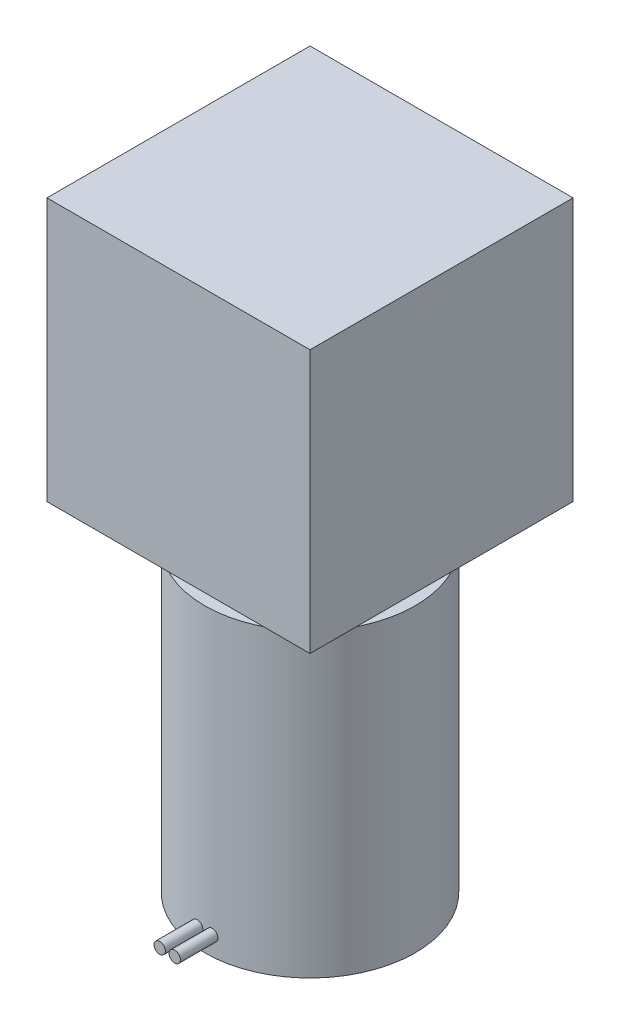
ISO-10303-21;
HEADER;
FILE_DESCRIPTION(('STEP AP214'),'2;1');
FILE_NAME('part.step','',(''),(''),'','','');
FILE_SCHEMA(('AUTOMOTIVE_DESIGN { 1 0 10303 214 1 1 1 1 }'));
ENDSEC;
DATA;
#1=APPLICATION_CONTEXT('core data for automotive mechanical design processes');
#2=APPLICATION_PROTOCOL_DEFINITION('international standard','automotive_design',2000,#1);
#3=PRODUCT_CONTEXT('',#1,'mechanical');
#4=PRODUCT('Part','Part','',(#3));
#5=PRODUCT_RELATED_PRODUCT_CATEGORY('part','',(#4));
#6=PRODUCT_DEFINITION_FORMATION('','',#4);
#7=PRODUCT_DEFINITION_CONTEXT('part definition',#1,'design');
#8=PRODUCT_DEFINITION('design','',#6,#7);
#9=PRODUCT_DEFINITION_SHAPE('','',#8);
#10=(LENGTH_UNIT() NAMED_UNIT(*) SI_UNIT(.MILLI.,.METRE.));
#11=(NAMED_UNIT(*) PLANE_ANGLE_UNIT() SI_UNIT($,.RADIAN.));
#12=(NAMED_UNIT(*) SI_UNIT($,.STERADIAN.) SOLID_ANGLE_UNIT());
#13=UNCERTAINTY_MEASURE_WITH_UNIT(LENGTH_MEASURE(1.E-05),#10,'distance_accuracy_value','');
#14=(GEOMETRIC_REPRESENTATION_CONTEXT(3) GLOBAL_UNCERTAINTY_ASSIGNED_CONTEXT((#13)) GLOBAL_UNIT_ASSIGNED_CONTEXT((#10,
#11,#12)) REPRESENTATION_CONTEXT('',''));
#15=CARTESIAN_POINT('',(0.,0.,0.));
#16=DIRECTION('',(0.,0.,1.));
#17=DIRECTION('',(1.,0.,0.));
#18=AXIS2_PLACEMENT_3D('',#15,#16,#17);
#19=CARTESIAN_POINT('',(2.,5.15388931428029,38.));
#20=DIRECTION('',(0.,0.,-1.));
#21=DIRECTION('',(-1.,0.,0.));
#22=AXIS2_PLACEMENT_3D('',#19,#20,#21);
#23=CYLINDRICAL_SURFACE('',#22,1.5);
#24=CARTESIAN_POINT('',(2.,5.15388931428029,38.));
#25=DIRECTION('',(0.,0.,1.));
#26=DIRECTION('',(1.,0.,0.));
#27=AXIS2_PLACEMENT_3D('',#24,#25,#26);
#28=CIRCLE('',#27,1.5);
#29=CARTESIAN_POINT('',(3.5,5.15388931428029,38.));
#30=VERTEX_POINT('',#29);
#31=EDGE_CURVE('E11',#30,#30,#28,.T.);
#32=ORIENTED_EDGE('',*,*,#31,.F.);
#33=EDGE_LOOP('',(#32));
#34=FACE_BOUND('',#33,.T.);
#35=CARTESIAN_POINT('',(2.,5.15388931428029,28.));
#36=DIRECTION('',(0.,0.,1.));
#37=DIRECTION('',(1.,0.,0.));
#38=AXIS2_PLACEMENT_3D('',#35,#36,#37);
#39=CIRCLE('',#38,1.5);
#40=CARTESIAN_POINT('',(3.5,5.15388931428029,28.));
#41=VERTEX_POINT('',#40);
#42=EDGE_CURVE('E63',#41,#41,#39,.T.);
#43=ORIENTED_EDGE('',*,*,#42,.T.);
#44=EDGE_LOOP('',(#43));
#45=FACE_BOUND('',#44,.T.);
#46=ADVANCED_FACE('F60',(#34,#45),#23,.T.);
#47=CARTESIAN_POINT('',(2.,5.15388931428029,38.));
#48=DIRECTION('',(0.,0.,1.));
#49=DIRECTION('',(1.,0.,0.));
#50=AXIS2_PLACEMENT_3D('',#47,#48,#49);
#51=PLANE('',#50);
#52=ORIENTED_EDGE('',*,*,#31,.T.);
#53=EDGE_LOOP('',(#52));
#54=FACE_BOUND('',#53,.T.);
#55=ADVANCED_FACE('F77',(#54),#51,.T.);
#56=CARTESIAN_POINT('',(2.,5.15388931428029,28.));
#57=DIRECTION('',(0.,0.,1.));
#58=DIRECTION('',(1.,0.,0.));
#59=AXIS2_PLACEMENT_3D('',#56,#57,#58);
#60=PLANE('',#59);
#61=ORIENTED_EDGE('',*,*,#42,.F.);
#62=EDGE_LOOP('',(#61));
#63=FACE_BOUND('',#62,.T.);
#64=ADVANCED_FACE('F75',(#63),#60,.F.);
#65=CLOSED_SHELL('',(#46,#55,#64));
#66=MANIFOLD_SOLID_BREP('B2',#65);
#67=CARTESIAN_POINT('',(-2.,5.15388931428029,38.));
#68=DIRECTION('',(0.,0.,-1.));
#69=DIRECTION('',(-1.,0.,0.));
#70=AXIS2_PLACEMENT_3D('',#67,#68,#69);
#71=CYLINDRICAL_SURFACE('',#70,1.5);
#72=CARTESIAN_POINT('',(-2.,5.15388931428029,38.));
#73=DIRECTION('',(0.,0.,1.));
#74=DIRECTION('',(1.,0.,0.));
#75=AXIS2_PLACEMENT_3D('',#72,#73,#74);
#76=CIRCLE('',#75,1.5);
#77=CARTESIAN_POINT('',(-0.5,5.15388931428029,38.));
#78=VERTEX_POINT('',#77);
#79=EDGE_CURVE('E59',#78,#78,#76,.T.);
#80=ORIENTED_EDGE('',*,*,#79,.F.);
#81=EDGE_LOOP('',(#80));
#82=FACE_BOUND('',#81,.T.);
#83=CARTESIAN_POINT('',(-2.,5.15388931428029,28.));
#84=DIRECTION('',(0.,0.,1.));
#85=DIRECTION('',(1.,0.,0.));
#86=AXIS2_PLACEMENT_3D('',#83,#84,#85);
#87=CIRCLE('',#86,1.5);
#88=CARTESIAN_POINT('',(-0.5,5.15388931428029,28.));
#89=VERTEX_POINT('',#88);
#90=EDGE_CURVE('E124',#89,#89,#87,.T.);
#91=ORIENTED_EDGE('',*,*,#90,.T.);
#92=EDGE_LOOP('',(#91));
#93=FACE_BOUND('',#92,.T.);
#94=ADVANCED_FACE('F121',(#82,#93),#71,.T.);
#95=CARTESIAN_POINT('',(-2.,5.15388931428029,38.));
#96=DIRECTION('',(0.,0.,1.));
#97=DIRECTION('',(1.,0.,0.));
#98=AXIS2_PLACEMENT_3D('',#95,#96,#97);
#99=PLANE('',#98);
#100=ORIENTED_EDGE('',*,*,#79,.T.);
#101=EDGE_LOOP('',(#100));
#102=FACE_BOUND('',#101,.T.);
#103=ADVANCED_FACE('F138',(#102),#99,.T.);
#104=CARTESIAN_POINT('',(-2.,5.15388931428029,28.));
#105=DIRECTION('',(0.,0.,1.));
#106=DIRECTION('',(1.,0.,0.));
#107=AXIS2_PLACEMENT_3D('',#104,#105,#106);
#108=PLANE('',#107);
#109=ORIENTED_EDGE('',*,*,#90,.F.);
#110=EDGE_LOOP('',(#109));
#111=FACE_BOUND('',#110,.T.);
#112=ADVANCED_FACE('F136',(#111),#108,.F.);
#113=CLOSED_SHELL('',(#94,#103,#112));
#114=MANIFOLD_SOLID_BREP('B6',#113);
#115=CARTESIAN_POINT('',(0.,80.,0.));
#116=DIRECTION('',(0.,-1.,0.));
#117=DIRECTION('',(0.,0.,-1.));
#118=AXIS2_PLACEMENT_3D('',#115,#116,#117);
#119=CYLINDRICAL_SURFACE('',#118,28.);
#120=CARTESIAN_POINT('',(0.,80.,0.));
#121=DIRECTION('',(0.,1.,0.));
#122=DIRECTION('',(0.,0.,1.));
#123=AXIS2_PLACEMENT_3D('',#120,#121,#122);
#124=CIRCLE('',#123,28.);
#125=CARTESIAN_POINT('',(0.,80.,28.));
#126=VERTEX_POINT('',#125);
#127=EDGE_CURVE('E182',#126,#126,#124,.T.);
#128=ORIENTED_EDGE('',*,*,#127,.F.);
#129=EDGE_LOOP('',(#128));
#130=FACE_BOUND('',#129,.T.);
#131=CARTESIAN_POINT('',(0.,0.,0.));
#132=DIRECTION('',(0.,1.,0.));
#133=DIRECTION('',(0.,0.,1.));
#134=AXIS2_PLACEMENT_3D('',#131,#132,#133);
#135=CIRCLE('',#134,28.);
#136=CARTESIAN_POINT('',(0.,0.,28.));
#137=VERTEX_POINT('',#136);
#138=EDGE_CURVE('E176',#137,#137,#135,.T.);
#139=ORIENTED_EDGE('',*,*,#138,.T.);
#140=EDGE_LOOP('',(#139));
#141=FACE_BOUND('',#140,.T.);
#142=ADVANCED_FACE('F173',(#130,#141),#119,.T.);
#143=CARTESIAN_POINT('',(0.,80.,0.));
#144=DIRECTION('',(0.,1.,0.));
#145=DIRECTION('',(0.,0.,1.));
#146=AXIS2_PLACEMENT_3D('',#143,#144,#145);
#147=PLANE('',#146);
#148=CARTESIAN_POINT('',(0.,80.,0.));
#149=DIRECTION('',(0.,1.,0.));
#150=DIRECTION('',(0.,0.,1.));
#151=AXIS2_PLACEMENT_3D('',#148,#149,#150);
#152=CIRCLE('',#151,22.5);
#153=CARTESIAN_POINT('',(0.,80.,22.5));
#154=VERTEX_POINT('',#153);
#155=EDGE_CURVE('E119',#154,#154,#152,.T.);
#156=ORIENTED_EDGE('',*,*,#155,.F.);
#157=EDGE_LOOP('',(#156));
#158=FACE_BOUND('',#157,.T.);
#159=ORIENTED_EDGE('',*,*,#127,.T.);
#160=EDGE_LOOP('',(#159));
#161=FACE_BOUND('',#160,.T.);
#162=ADVANCED_FACE('F420',(#158,#161),#147,.T.);
#163=CARTESIAN_POINT('',(0.,0.,0.));
#164=DIRECTION('',(0.,1.,0.));
#165=DIRECTION('',(0.,0.,1.));
#166=AXIS2_PLACEMENT_3D('',#163,#164,#165);
#167=PLANE('',#166);
#168=ORIENTED_EDGE('',*,*,#138,.F.);
#169=EDGE_LOOP('',(#168));
#170=FACE_BOUND('',#169,.T.);
#171=ADVANCED_FACE('F417',(#170),#167,.F.);
#172=CARTESIAN_POINT('',(0.,90.,0.));
#173=DIRECTION('',(0.,-1.,0.));
#174=DIRECTION('',(0.,0.,-1.));
#175=AXIS2_PLACEMENT_3D('',#172,#173,#174);
#176=CYLINDRICAL_SURFACE('',#175,22.5);
#177=CARTESIAN_POINT('',(0.,90.,0.));
#178=DIRECTION('',(0.,1.,0.));
#179=DIRECTION('',(0.,0.,1.));
#180=AXIS2_PLACEMENT_3D('',#177,#178,#179);
#181=CIRCLE('',#180,22.5);
#182=CARTESIAN_POINT('',(0.,90.,22.5));
#183=VERTEX_POINT('',#182);
#184=EDGE_CURVE('E402',#183,#183,#181,.T.);
#185=ORIENTED_EDGE('',*,*,#184,.F.);
#186=EDGE_LOOP('',(#185));
#187=FACE_BOUND('',#186,.T.);
#188=ORIENTED_EDGE('',*,*,#155,.T.);
#189=EDGE_LOOP('',(#188));
#190=FACE_BOUND('',#189,.T.);
#191=ADVANCED_FACE('F419',(#187,#190),#176,.T.);
#192=CARTESIAN_POINT('',(35.,160.,-35.));
#193=DIRECTION('',(-1.,0.,0.));
#194=DIRECTION('',(0.,0.,1.));
#195=AXIS2_PLACEMENT_3D('',#192,#193,#194);
#196=PLANE('',#195);
#197=DIRECTION('',(0.,0.,-1.));
#198=VECTOR('',#197,1.);
#199=CARTESIAN_POINT('',(35.,90.,-35.));
#200=LINE('',#199,#198);
#201=CARTESIAN_POINT('',(35.,90.,35.));
#202=VERTEX_POINT('',#201);
#203=CARTESIAN_POINT('',(35.,90.,-35.));
#204=VERTEX_POINT('',#203);
#205=EDGE_CURVE('E365',#202,#204,#200,.T.);
#206=ORIENTED_EDGE('',*,*,#205,.T.);
#207=DIRECTION('',(0.,-1.,0.));
#208=VECTOR('',#207,1.);
#209=CARTESIAN_POINT('',(35.,160.,-35.));
#210=LINE('',#209,#208);
#211=CARTESIAN_POINT('',(35.,160.,-35.));
#212=VERTEX_POINT('',#211);
#213=EDGE_CURVE('E399',#212,#204,#210,.T.);
#214=ORIENTED_EDGE('',*,*,#213,.F.);
#215=DIRECTION('',(0.,0.,-1.));
#216=VECTOR('',#215,1.);
#217=CARTESIAN_POINT('',(35.,160.,-35.));
#218=LINE('',#217,#216);
#219=CARTESIAN_POINT('',(35.,160.,35.));
#220=VERTEX_POINT('',#219);
#221=EDGE_CURVE('E369',#220,#212,#218,.T.);
#222=ORIENTED_EDGE('',*,*,#221,.F.);
#223=DIRECTION('',(0.,-1.,0.));
#224=VECTOR('',#223,1.);
#225=CARTESIAN_POINT('',(35.,160.,35.));
#226=LINE('',#225,#224);
#227=EDGE_CURVE('E379',#220,#202,#226,.T.);
#228=ORIENTED_EDGE('',*,*,#227,.T.);
#229=EDGE_LOOP('',(#206,#214,#222,#228));
#230=FACE_BOUND('',#229,.T.);
#231=ADVANCED_FACE('F424',(#230),#196,.F.);
#232=CARTESIAN_POINT('',(-35.,160.,-35.));
#233=DIRECTION('',(0.,0.,1.));
#234=DIRECTION('',(1.,0.,0.));
#235=AXIS2_PLACEMENT_3D('',#232,#233,#234);
#236=PLANE('',#235);
#237=DIRECTION('',(-1.,0.,0.));
#238=VECTOR('',#237,1.);
#239=CARTESIAN_POINT('',(-35.,90.,-35.));
#240=LINE('',#239,#238);
#241=CARTESIAN_POINT('',(-35.,90.,-35.));
#242=VERTEX_POINT('',#241);
#243=EDGE_CURVE('E383',#204,#242,#240,.T.);
#244=ORIENTED_EDGE('',*,*,#243,.T.);
#245=DIRECTION('',(0.,-1.,0.));
#246=VECTOR('',#245,1.);
#247=CARTESIAN_POINT('',(-35.,160.,-35.));
#248=LINE('',#247,#246);
#249=CARTESIAN_POINT('',(-35.,160.,-35.));
#250=VERTEX_POINT('',#249);
#251=EDGE_CURVE('E395',#250,#242,#248,.T.);
#252=ORIENTED_EDGE('',*,*,#251,.F.);
#253=DIRECTION('',(-1.,0.,0.));
#254=VECTOR('',#253,1.);
#255=CARTESIAN_POINT('',(-35.,160.,-35.));
#256=LINE('',#255,#254);
#257=EDGE_CURVE('E228',#212,#250,#256,.T.);
#258=ORIENTED_EDGE('',*,*,#257,.F.);
#259=ORIENTED_EDGE('',*,*,#213,.T.);
#260=EDGE_LOOP('',(#244,#252,#258,#259));
#261=FACE_BOUND('',#260,.T.);
#262=ADVANCED_FACE('F451',(#261),#236,.F.);
#263=CARTESIAN_POINT('',(-35.,160.,-35.));
#264=DIRECTION('',(1.,0.,0.));
#265=DIRECTION('',(0.,0.,-1.));
#266=AXIS2_PLACEMENT_3D('',#263,#264,#265);
#267=PLANE('',#266);
#268=CARTESIAN_POINT('',(-35.,125.,0.));
#269=DIRECTION('',(-1.,0.,0.));
#270=DIRECTION('',(0.,0.,1.));
#271=AXIS2_PLACEMENT_3D('',#268,#269,#270);
#272=CIRCLE('',#271,18.4154380014951);
#273=CARTESIAN_POINT('',(-35.,125.,18.4154380014951));
#274=VERTEX_POINT('',#273);
#275=EDGE_CURVE('E728',#274,#274,#272,.T.);
#276=ORIENTED_EDGE('',*,*,#275,.F.);
#277=EDGE_LOOP('',(#276));
#278=FACE_BOUND('',#277,.T.);
#279=CARTESIAN_POINT('',(-35.,152.,0.));
#280=DIRECTION('',(-1.,0.,0.));
#281=DIRECTION('',(0.,0.,1.));
#282=AXIS2_PLACEMENT_3D('',#279,#280,#281);
#283=CIRCLE('',#282,2.5);
#284=CARTESIAN_POINT('',(-35.,152.,2.50000000000001));
#285=VERTEX_POINT('',#284);
#286=EDGE_CURVE('E336',#285,#285,#283,.T.);
#287=ORIENTED_EDGE('',*,*,#286,.F.);
#288=EDGE_LOOP('',(#287));
#289=FACE_BOUND('',#288,.T.);
#290=CARTESIAN_POINT('',(-35.,144.091883092037,19.091883092037));
#291=DIRECTION('',(-1.,0.,0.));
#292=DIRECTION('',(0.,0.,1.));
#293=AXIS2_PLACEMENT_3D('',#290,#291,#292);
#294=CIRCLE('',#293,2.50000000000001);
#295=CARTESIAN_POINT('',(-35.,144.091883092037,21.591883092037));
#296=VERTEX_POINT('',#295);
#297=EDGE_CURVE('E344',#296,#296,#294,.T.);
#298=ORIENTED_EDGE('',*,*,#297,.F.);
#299=EDGE_LOOP('',(#298));
#300=FACE_BOUND('',#299,.T.);
#301=CARTESIAN_POINT('',(-35.,125.000000000001,27.0000000000007));
#302=DIRECTION('',(-1.,0.,0.));
#303=DIRECTION('',(0.,0.,1.));
#304=AXIS2_PLACEMENT_3D('',#301,#302,#303);
#305=CIRCLE('',#304,2.50000000000001);
#306=CARTESIAN_POINT('',(-35.,125.000000000001,29.5000000000008));
#307=VERTEX_POINT('',#306);
#308=EDGE_CURVE('E352',#307,#307,#305,.T.);
#309=ORIENTED_EDGE('',*,*,#308,.F.);
#310=EDGE_LOOP('',(#309));
#311=FACE_BOUND('',#310,.T.);
#312=CARTESIAN_POINT('',(-35.,105.908116907964,19.091883092038));
#313=DIRECTION('',(-1.,0.,0.));
#314=DIRECTION('',(0.,0.,1.));
#315=AXIS2_PLACEMENT_3D('',#312,#313,#314);
#316=CIRCLE('',#315,2.49999999999999);
#317=CARTESIAN_POINT('',(-35.,105.908116907964,21.591883092038));
#318=VERTEX_POINT('',#317);
#319=EDGE_CURVE('E304',#318,#318,#316,.T.);
#320=ORIENTED_EDGE('',*,*,#319,.F.);
#321=EDGE_LOOP('',(#320));
#322=FACE_BOUND('',#321,.T.);
#323=CARTESIAN_POINT('',(-35.,98.,1.33647557846545E-12));
#324=DIRECTION('',(-1.,0.,0.));
#325=DIRECTION('',(0.,0.,1.));
#326=AXIS2_PLACEMENT_3D('',#323,#324,#325);
#327=CIRCLE('',#326,2.5);
#328=CARTESIAN_POINT('',(-35.,98.,2.50000000000134));
#329=VERTEX_POINT('',#328);
#330=EDGE_CURVE('E305',#329,#329,#327,.T.);
#331=ORIENTED_EDGE('',*,*,#330,.F.);
#332=EDGE_LOOP('',(#331));
#333=FACE_BOUND('',#332,.T.);
#334=CARTESIAN_POINT('',(-35.,105.908116907963,-19.0918830920357));
#335=DIRECTION('',(-1.,0.,0.));
#336=DIRECTION('',(0.,0.,1.));
#337=AXIS2_PLACEMENT_3D('',#334,#335,#336);
#338=CIRCLE('',#337,2.49999999999999);
#339=CARTESIAN_POINT('',(-35.,105.908116907963,-16.5918830920357));
#340=VERTEX_POINT('',#339);
#341=EDGE_CURVE('E313',#340,#340,#338,.T.);
#342=ORIENTED_EDGE('',*,*,#341,.F.);
#343=EDGE_LOOP('',(#342));
#344=FACE_BOUND('',#343,.T.);
#345=CARTESIAN_POINT('',(-35.,125.,-26.9999999999992));
#346=DIRECTION('',(-1.,0.,0.));
#347=DIRECTION('',(0.,0.,1.));
#348=AXIS2_PLACEMENT_3D('',#345,#346,#347);
#349=CIRCLE('',#348,2.5);
#350=CARTESIAN_POINT('',(-35.,125.,-24.4999999999992));
#351=VERTEX_POINT('',#350);
#352=EDGE_CURVE('E321',#351,#351,#349,.T.);
#353=ORIENTED_EDGE('',*,*,#352,.F.);
#354=EDGE_LOOP('',(#353));
#355=FACE_BOUND('',#354,.T.);
#356=CARTESIAN_POINT('',(-35.,144.091883092036,-19.0918830920363));
#357=DIRECTION('',(-1.,0.,0.));
#358=DIRECTION('',(0.,0.,1.));
#359=AXIS2_PLACEMENT_3D('',#356,#357,#358);
#360=CIRCLE('',#359,2.49999999999999);
#361=CARTESIAN_POINT('',(-35.,144.091883092036,-16.5918830920363));
#362=VERTEX_POINT('',#361);
#363=EDGE_CURVE('E299',#362,#362,#360,.T.);
#364=ORIENTED_EDGE('',*,*,#363,.F.);
#365=EDGE_LOOP('',(#364));
#366=FACE_BOUND('',#365,.T.);
#367=DIRECTION('',(0.,0.,1.));
#368=VECTOR('',#367,1.);
#369=CARTESIAN_POINT('',(-35.,90.,-35.));
#370=LINE('',#369,#368);
#371=CARTESIAN_POINT('',(-35.,90.,35.));
#372=VERTEX_POINT('',#371);
#373=EDGE_CURVE('E386',#242,#372,#370,.T.);
#374=ORIENTED_EDGE('',*,*,#373,.T.);
#375=DIRECTION('',(0.,-1.,0.));
#376=VECTOR('',#375,1.);
#377=CARTESIAN_POINT('',(-35.,160.,35.));
#378=LINE('',#377,#376);
#379=CARTESIAN_POINT('',(-35.,160.,35.));
#380=VERTEX_POINT('',#379);
#381=EDGE_CURVE('E392',#380,#372,#378,.T.);
#382=ORIENTED_EDGE('',*,*,#381,.F.);
#383=DIRECTION('',(0.,0.,1.));
#384=VECTOR('',#383,1.);
#385=CARTESIAN_POINT('',(-35.,160.,-35.));
#386=LINE('',#385,#384);
#387=EDGE_CURVE('E374',#250,#380,#386,.T.);
#388=ORIENTED_EDGE('',*,*,#387,.F.);
#389=ORIENTED_EDGE('',*,*,#251,.T.);
#390=EDGE_LOOP('',(#374,#382,#388,#389));
#391=FACE_BOUND('',#390,.T.);
#392=ADVANCED_FACE('F460',(#278,#289,#300,#311,#322,#333,#344,#355,#366,#391),#267,.F.);
#393=CARTESIAN_POINT('',(-35.,160.,35.));
#394=DIRECTION('',(0.,0.,-1.));
#395=DIRECTION('',(-1.,0.,0.));
#396=AXIS2_PLACEMENT_3D('',#393,#394,#395);
#397=PLANE('',#396);
#398=DIRECTION('',(1.,0.,0.));
#399=VECTOR('',#398,1.);
#400=CARTESIAN_POINT('',(-35.,90.,35.));
#401=LINE('',#400,#399);
#402=EDGE_CURVE('E220',#372,#202,#401,.T.);
#403=ORIENTED_EDGE('',*,*,#402,.T.);
#404=ORIENTED_EDGE('',*,*,#227,.F.);
#405=DIRECTION('',(1.,0.,0.));
#406=VECTOR('',#405,1.);
#407=CARTESIAN_POINT('',(-35.,160.,35.));
#408=LINE('',#407,#406);
#409=EDGE_CURVE('E199',#380,#220,#408,.T.);
#410=ORIENTED_EDGE('',*,*,#409,.F.);
#411=ORIENTED_EDGE('',*,*,#381,.T.);
#412=EDGE_LOOP('',(#403,#404,#410,#411));
#413=FACE_BOUND('',#412,.T.);
#414=ADVANCED_FACE('F466',(#413),#397,.F.);
#415=CARTESIAN_POINT('',(0.,160.,0.));
#416=DIRECTION('',(0.,1.,0.));
#417=DIRECTION('',(0.,0.,1.));
#418=AXIS2_PLACEMENT_3D('',#415,#416,#417);
#419=PLANE('',#418);
#420=ORIENTED_EDGE('',*,*,#221,.T.);
#421=ORIENTED_EDGE('',*,*,#257,.T.);
#422=ORIENTED_EDGE('',*,*,#387,.T.);
#423=ORIENTED_EDGE('',*,*,#409,.T.);
#424=EDGE_LOOP('',(#420,#421,#422,#423));
#425=FACE_BOUND('',#424,.T.);
#426=ADVANCED_FACE('F471',(#425),#419,.T.);
#427=CARTESIAN_POINT('',(0.,90.,0.));
#428=DIRECTION('',(0.,1.,0.));
#429=DIRECTION('',(0.,0.,1.));
#430=AXIS2_PLACEMENT_3D('',#427,#428,#429);
#431=PLANE('',#430);
#432=ORIENTED_EDGE('',*,*,#184,.T.);
#433=EDGE_LOOP('',(#432));
#434=FACE_BOUND('',#433,.T.);
#435=ORIENTED_EDGE('',*,*,#205,.F.);
#436=ORIENTED_EDGE('',*,*,#402,.F.);
#437=ORIENTED_EDGE('',*,*,#373,.F.);
#438=ORIENTED_EDGE('',*,*,#243,.F.);
#439=EDGE_LOOP('',(#435,#436,#437,#438));
#440=FACE_BOUND('',#439,.T.);
#441=ADVANCED_FACE('F479',(#434,#440),#431,.F.);
#442=CARTESIAN_POINT('',(-15.,144.091883092036,-19.0918830920363));
#443=DIRECTION('',(-1.,0.,0.));
#444=DIRECTION('',(0.,0.,1.));
#445=AXIS2_PLACEMENT_3D('',#442,#443,#444);
#446=CYLINDRICAL_SURFACE('',#445,2.49999999999999);
#447=CARTESIAN_POINT('',(-15.,144.091883092036,-19.0918830920363));
#448=DIRECTION('',(-1.,0.,0.));
#449=DIRECTION('',(0.,0.,1.));
#450=AXIS2_PLACEMENT_3D('',#447,#448,#449);
#451=CIRCLE('',#450,2.49999999999999);
#452=CARTESIAN_POINT('',(-15.,144.091883092036,-16.5918830920363));
#453=VERTEX_POINT('',#452);
#454=EDGE_CURVE('E325',#453,#453,#451,.T.);
#455=ORIENTED_EDGE('',*,*,#454,.F.);
#456=EDGE_LOOP('',(#455));
#457=FACE_BOUND('',#456,.T.);
#458=ORIENTED_EDGE('',*,*,#363,.T.);
#459=EDGE_LOOP('',(#458));
#460=FACE_BOUND('',#459,.T.);
#461=ADVANCED_FACE('F487',(#457,#460),#446,.F.);
#462=CARTESIAN_POINT('',(-15.,144.091883092036,-19.0918830920363));
#463=DIRECTION('',(-1.,0.,0.));
#464=DIRECTION('',(0.,0.,1.));
#465=AXIS2_PLACEMENT_3D('',#462,#463,#464);
#466=PLANE('',#465);
#467=ORIENTED_EDGE('',*,*,#454,.T.);
#468=EDGE_LOOP('',(#467));
#469=FACE_BOUND('',#468,.T.);
#470=ADVANCED_FACE('F497',(#469),#466,.T.);
#471=CARTESIAN_POINT('',(-15.,125.,-26.9999999999992));
#472=DIRECTION('',(-1.,0.,0.));
#473=DIRECTION('',(0.,0.,1.));
#474=AXIS2_PLACEMENT_3D('',#471,#472,#473);
#475=CYLINDRICAL_SURFACE('',#474,2.5);
#476=CARTESIAN_POINT('',(-15.,125.,-26.9999999999992));
#477=DIRECTION('',(-1.,0.,0.));
#478=DIRECTION('',(0.,0.,1.));
#479=AXIS2_PLACEMENT_3D('',#476,#477,#478);
#480=CIRCLE('',#479,2.5);
#481=CARTESIAN_POINT('',(-15.,125.,-24.4999999999992));
#482=VERTEX_POINT('',#481);
#483=EDGE_CURVE('E317',#482,#482,#480,.T.);
#484=ORIENTED_EDGE('',*,*,#483,.F.);
#485=EDGE_LOOP('',(#484));
#486=FACE_BOUND('',#485,.T.);
#487=ORIENTED_EDGE('',*,*,#352,.T.);
#488=EDGE_LOOP('',(#487));
#489=FACE_BOUND('',#488,.T.);
#490=ADVANCED_FACE('F507',(#486,#489),#475,.F.);
#491=CARTESIAN_POINT('',(-15.,125.,-26.9999999999992));
#492=DIRECTION('',(-1.,0.,0.));
#493=DIRECTION('',(0.,0.,1.));
#494=AXIS2_PLACEMENT_3D('',#491,#492,#493);
#495=PLANE('',#494);
#496=ORIENTED_EDGE('',*,*,#483,.T.);
#497=EDGE_LOOP('',(#496));
#498=FACE_BOUND('',#497,.T.);
#499=ADVANCED_FACE('F516',(#498),#495,.T.);
#500=CARTESIAN_POINT('',(-15.,105.908116907963,-19.0918830920357));
#501=DIRECTION('',(-1.,0.,0.));
#502=DIRECTION('',(0.,0.,1.));
#503=AXIS2_PLACEMENT_3D('',#500,#501,#502);
#504=CYLINDRICAL_SURFACE('',#503,2.49999999999999);
#505=CARTESIAN_POINT('',(-15.,105.908116907963,-19.0918830920357));
#506=DIRECTION('',(-1.,0.,0.));
#507=DIRECTION('',(0.,0.,1.));
#508=AXIS2_PLACEMENT_3D('',#505,#506,#507);
#509=CIRCLE('',#508,2.49999999999999);
#510=CARTESIAN_POINT('',(-15.,105.908116907963,-16.5918830920357));
#511=VERTEX_POINT('',#510);
#512=EDGE_CURVE('E309',#511,#511,#509,.T.);
#513=ORIENTED_EDGE('',*,*,#512,.F.);
#514=EDGE_LOOP('',(#513));
#515=FACE_BOUND('',#514,.T.);
#516=ORIENTED_EDGE('',*,*,#341,.T.);
#517=EDGE_LOOP('',(#516));
#518=FACE_BOUND('',#517,.T.);
#519=ADVANCED_FACE('F525',(#515,#518),#504,.F.);
#520=CARTESIAN_POINT('',(-15.,105.908116907963,-19.0918830920357));
#521=DIRECTION('',(-1.,0.,0.));
#522=DIRECTION('',(0.,0.,1.));
#523=AXIS2_PLACEMENT_3D('',#520,#521,#522);
#524=PLANE('',#523);
#525=ORIENTED_EDGE('',*,*,#512,.T.);
#526=EDGE_LOOP('',(#525));
#527=FACE_BOUND('',#526,.T.);
#528=ADVANCED_FACE('F534',(#527),#524,.T.);
#529=CARTESIAN_POINT('',(-15.,98.,1.33449303735005E-12));
#530=DIRECTION('',(-1.,0.,0.));
#531=DIRECTION('',(0.,0.,1.));
#532=AXIS2_PLACEMENT_3D('',#529,#530,#531);
#533=CYLINDRICAL_SURFACE('',#532,2.5);
#534=CARTESIAN_POINT('',(-15.,98.,1.33449303735005E-12));
#535=DIRECTION('',(-1.,0.,0.));
#536=DIRECTION('',(0.,0.,1.));
#537=AXIS2_PLACEMENT_3D('',#534,#535,#536);
#538=CIRCLE('',#537,2.5);
#539=CARTESIAN_POINT('',(-15.,98.,2.50000000000133));
#540=VERTEX_POINT('',#539);
#541=EDGE_CURVE('E300',#540,#540,#538,.T.);
#542=ORIENTED_EDGE('',*,*,#541,.F.);
#543=EDGE_LOOP('',(#542));
#544=FACE_BOUND('',#543,.T.);
#545=ORIENTED_EDGE('',*,*,#330,.T.);
#546=EDGE_LOOP('',(#545));
#547=FACE_BOUND('',#546,.T.);
#548=ADVANCED_FACE('F543',(#544,#547),#533,.F.);
#549=CARTESIAN_POINT('',(-15.,98.,1.33449303735005E-12));
#550=DIRECTION('',(-1.,0.,0.));
#551=DIRECTION('',(0.,0.,1.));
#552=AXIS2_PLACEMENT_3D('',#549,#550,#551);
#553=PLANE('',#552);
#554=ORIENTED_EDGE('',*,*,#541,.T.);
#555=EDGE_LOOP('',(#554));
#556=FACE_BOUND('',#555,.T.);
#557=ADVANCED_FACE('F552',(#556),#553,.T.);
#558=CARTESIAN_POINT('',(-15.,105.908116907964,19.091883092038));
#559=DIRECTION('',(-1.,0.,0.));
#560=DIRECTION('',(0.,0.,1.));
#561=AXIS2_PLACEMENT_3D('',#558,#559,#560);
#562=CYLINDRICAL_SURFACE('',#561,2.49999999999999);
#563=CARTESIAN_POINT('',(-15.,105.908116907964,19.091883092038));
#564=DIRECTION('',(-1.,0.,0.));
#565=DIRECTION('',(0.,0.,1.));
#566=AXIS2_PLACEMENT_3D('',#563,#564,#565);
#567=CIRCLE('',#566,2.49999999999999);
#568=CARTESIAN_POINT('',(-15.,105.908116907964,21.591883092038));
#569=VERTEX_POINT('',#568);
#570=EDGE_CURVE('E356',#569,#569,#567,.T.);
#571=ORIENTED_EDGE('',*,*,#570,.F.);
#572=EDGE_LOOP('',(#571));
#573=FACE_BOUND('',#572,.T.);
#574=ORIENTED_EDGE('',*,*,#319,.T.);
#575=EDGE_LOOP('',(#574));
#576=FACE_BOUND('',#575,.T.);
#577=ADVANCED_FACE('F561',(#573,#576),#562,.F.);
#578=CARTESIAN_POINT('',(-15.,105.908116907964,19.091883092038));
#579=DIRECTION('',(-1.,0.,0.));
#580=DIRECTION('',(0.,0.,1.));
#581=AXIS2_PLACEMENT_3D('',#578,#579,#580);
#582=PLANE('',#581);
#583=ORIENTED_EDGE('',*,*,#570,.T.);
#584=EDGE_LOOP('',(#583));
#585=FACE_BOUND('',#584,.T.);
#586=ADVANCED_FACE('F570',(#585),#582,.T.);
#587=CARTESIAN_POINT('',(-15.,125.000000000001,27.0000000000007));
#588=DIRECTION('',(-1.,0.,0.));
#589=DIRECTION('',(0.,0.,1.));
#590=AXIS2_PLACEMENT_3D('',#587,#588,#589);
#591=CYLINDRICAL_SURFACE('',#590,2.50000000000001);
#592=CARTESIAN_POINT('',(-15.,125.000000000001,27.0000000000007));
#593=DIRECTION('',(-1.,0.,0.));
#594=DIRECTION('',(0.,0.,1.));
#595=AXIS2_PLACEMENT_3D('',#592,#593,#594);
#596=CIRCLE('',#595,2.50000000000001);
#597=CARTESIAN_POINT('',(-15.,125.000000000001,29.5000000000008));
#598=VERTEX_POINT('',#597);
#599=EDGE_CURVE('E348',#598,#598,#596,.T.);
#600=ORIENTED_EDGE('',*,*,#599,.F.);
#601=EDGE_LOOP('',(#600));
#602=FACE_BOUND('',#601,.T.);
#603=ORIENTED_EDGE('',*,*,#308,.T.);
#604=EDGE_LOOP('',(#603));
#605=FACE_BOUND('',#604,.T.);
#606=ADVANCED_FACE('F579',(#602,#605),#591,.F.);
#607=CARTESIAN_POINT('',(-15.,125.000000000001,27.0000000000007));
#608=DIRECTION('',(-1.,0.,0.));
#609=DIRECTION('',(0.,0.,1.));
#610=AXIS2_PLACEMENT_3D('',#607,#608,#609);
#611=PLANE('',#610);
#612=ORIENTED_EDGE('',*,*,#599,.T.);
#613=EDGE_LOOP('',(#612));
#614=FACE_BOUND('',#613,.T.);
#615=ADVANCED_FACE('F588',(#614),#611,.T.);
#616=CARTESIAN_POINT('',(-15.,144.091883092037,19.091883092037));
#617=DIRECTION('',(-1.,0.,0.));
#618=DIRECTION('',(0.,0.,1.));
#619=AXIS2_PLACEMENT_3D('',#616,#617,#618);
#620=CYLINDRICAL_SURFACE('',#619,2.50000000000001);
#621=CARTESIAN_POINT('',(-15.,144.091883092037,19.091883092037));
#622=DIRECTION('',(-1.,0.,0.));
#623=DIRECTION('',(0.,0.,1.));
#624=AXIS2_PLACEMENT_3D('',#621,#622,#623);
#625=CIRCLE('',#624,2.50000000000001);
#626=CARTESIAN_POINT('',(-15.,144.091883092037,21.591883092037));
#627=VERTEX_POINT('',#626);
#628=EDGE_CURVE('E340',#627,#627,#625,.T.);
#629=ORIENTED_EDGE('',*,*,#628,.F.);
#630=EDGE_LOOP('',(#629));
#631=FACE_BOUND('',#630,.T.);
#632=ORIENTED_EDGE('',*,*,#297,.T.);
#633=EDGE_LOOP('',(#632));
#634=FACE_BOUND('',#633,.T.);
#635=ADVANCED_FACE('F597',(#631,#634),#620,.F.);
#636=CARTESIAN_POINT('',(-15.,144.091883092037,19.091883092037));
#637=DIRECTION('',(-1.,0.,0.));
#638=DIRECTION('',(0.,0.,1.));
#639=AXIS2_PLACEMENT_3D('',#636,#637,#638);
#640=PLANE('',#639);
#641=ORIENTED_EDGE('',*,*,#628,.T.);
#642=EDGE_LOOP('',(#641));
#643=FACE_BOUND('',#642,.T.);
#644=ADVANCED_FACE('F606',(#643),#640,.T.);
#645=CARTESIAN_POINT('',(-15.,152.,0.));
#646=DIRECTION('',(-1.,0.,0.));
#647=DIRECTION('',(0.,0.,1.));
#648=AXIS2_PLACEMENT_3D('',#645,#646,#647);
#649=CYLINDRICAL_SURFACE('',#648,2.5);
#650=CARTESIAN_POINT('',(-15.,152.,0.));
#651=DIRECTION('',(-1.,0.,0.));
#652=DIRECTION('',(0.,0.,1.));
#653=AXIS2_PLACEMENT_3D('',#650,#651,#652);
#654=CIRCLE('',#653,2.5);
#655=CARTESIAN_POINT('',(-15.,152.,2.5));
#656=VERTEX_POINT('',#655);
#657=EDGE_CURVE('E331',#656,#656,#654,.T.);
#658=ORIENTED_EDGE('',*,*,#657,.F.);
#659=EDGE_LOOP('',(#658));
#660=FACE_BOUND('',#659,.T.);
#661=ORIENTED_EDGE('',*,*,#286,.T.);
#662=EDGE_LOOP('',(#661));
#663=FACE_BOUND('',#662,.T.);
#664=ADVANCED_FACE('F615',(#660,#663),#649,.F.);
#665=CARTESIAN_POINT('',(-15.,152.,0.));
#666=DIRECTION('',(-1.,0.,0.));
#667=DIRECTION('',(0.,0.,1.));
#668=AXIS2_PLACEMENT_3D('',#665,#666,#667);
#669=PLANE('',#668);
#670=ORIENTED_EDGE('',*,*,#657,.T.);
#671=EDGE_LOOP('',(#670));
#672=FACE_BOUND('',#671,.T.);
#673=ADVANCED_FACE('F624',(#672),#669,.T.);
#674=CARTESIAN_POINT('',(-25.,125.,0.));
#675=DIRECTION('',(-1.,0.,0.));
#676=DIRECTION('',(0.,0.,1.));
#677=AXIS2_PLACEMENT_3D('',#674,#675,#676);
#678=CYLINDRICAL_SURFACE('',#677,18.4154380014951);
#679=CARTESIAN_POINT('',(-25.,125.,0.));
#680=DIRECTION('',(-1.,0.,0.));
#681=DIRECTION('',(0.,0.,1.));
#682=AXIS2_PLACEMENT_3D('',#679,#680,#681);
#683=CIRCLE('',#682,18.4154380014951);
#684=CARTESIAN_POINT('',(-25.,125.,18.4154380014951));
#685=VERTEX_POINT('',#684);
#686=EDGE_CURVE('E285',#685,#685,#683,.T.);
#687=ORIENTED_EDGE('',*,*,#686,.F.);
#688=EDGE_LOOP('',(#687));
#689=FACE_BOUND('',#688,.T.);
#690=ORIENTED_EDGE('',*,*,#275,.T.);
#691=EDGE_LOOP('',(#690));
#692=FACE_BOUND('',#691,.T.);
#693=ADVANCED_FACE('F633',(#689,#692),#678,.F.);
#694=CARTESIAN_POINT('',(-25.,125.,0.));
#695=DIRECTION('',(-1.,0.,0.));
#696=DIRECTION('',(0.,0.,1.));
#697=AXIS2_PLACEMENT_3D('',#694,#695,#696);
#698=PLANE('',#697);
#699=CARTESIAN_POINT('',(-25.,125.,0.));
#700=DIRECTION('',(-1.,0.,0.));
#701=DIRECTION('',(0.,0.,1.));
#702=AXIS2_PLACEMENT_3D('',#699,#700,#701);
#703=CIRCLE('',#702,7.73427491915976);
#704=CARTESIAN_POINT('',(-25.,125.,7.73427491915976));
#705=VERTEX_POINT('',#704);
#706=EDGE_CURVE('E723',#705,#705,#703,.T.);
#707=ORIENTED_EDGE('',*,*,#706,.F.);
#708=EDGE_LOOP('',(#707));
#709=FACE_BOUND('',#708,.T.);
#710=ORIENTED_EDGE('',*,*,#686,.T.);
#711=EDGE_LOOP('',(#710));
#712=FACE_BOUND('',#711,.T.);
#713=ADVANCED_FACE('F691',(#709,#712),#698,.T.);
#714=CARTESIAN_POINT('',(-25.,125.,0.));
#715=DIRECTION('',(-1.,0.,0.));
#716=DIRECTION('',(0.,0.,1.));
#717=AXIS2_PLACEMENT_3D('',#714,#715,#716);
#718=CYLINDRICAL_SURFACE('',#717,7.73427491915976);
#719=ORIENTED_EDGE('',*,*,#706,.T.);
#720=EDGE_LOOP('',(#719));
#721=FACE_BOUND('',#720,.T.);
#722=CARTESIAN_POINT('',(-35.,125.,0.));
#723=DIRECTION('',(-1.,0.,0.));
#724=DIRECTION('',(0.,0.,1.));
#725=AXIS2_PLACEMENT_3D('',#722,#723,#724);
#726=CIRCLE('',#725,7.73427491915976);
#727=CARTESIAN_POINT('',(-35.,125.,7.73427491915976));
#728=VERTEX_POINT('',#727);
#729=EDGE_CURVE('E720',#728,#728,#726,.T.);
#730=ORIENTED_EDGE('',*,*,#729,.F.);
#731=EDGE_LOOP('',(#730));
#732=FACE_BOUND('',#731,.T.);
#733=ADVANCED_FACE('F655',(#721,#732),#718,.T.);
#734=CARTESIAN_POINT('',(-15.,125.,0.));
#735=DIRECTION('',(-1.,0.,0.));
#736=DIRECTION('',(0.,0.,1.));
#737=AXIS2_PLACEMENT_3D('',#734,#735,#736);
#738=PLANE('',#737);
#739=CARTESIAN_POINT('',(-15.,125.,0.));
#740=DIRECTION('',(-1.,0.,0.));
#741=DIRECTION('',(0.,0.,1.));
#742=AXIS2_PLACEMENT_3D('',#739,#740,#741);
#743=CIRCLE('',#742,5.5);
#744=CARTESIAN_POINT('',(-15.,123.5,-5.29150262212918));
#745=VERTEX_POINT('',#744);
#746=CARTESIAN_POINT('',(-15.,126.5,-5.29150262212918));
#747=VERTEX_POINT('',#746);
#748=EDGE_CURVE('E255',#745,#747,#743,.T.);
#749=ORIENTED_EDGE('',*,*,#748,.T.);
#750=DIRECTION('',(0.,0.,-1.));
#751=VECTOR('',#750,1.);
#752=CARTESIAN_POINT('',(-15.,126.5,-6.5));
#753=LINE('',#752,#751);
#754=CARTESIAN_POINT('',(-15.,126.5,-6.5));
#755=VERTEX_POINT('',#754);
#756=EDGE_CURVE('E249',#747,#755,#753,.T.);
#757=ORIENTED_EDGE('',*,*,#756,.T.);
#758=DIRECTION('',(0.,-1.,0.));
#759=VECTOR('',#758,1.);
#760=CARTESIAN_POINT('',(-15.,126.5,-6.5));
#761=LINE('',#760,#759);
#762=CARTESIAN_POINT('',(-15.,123.5,-6.5));
#763=VERTEX_POINT('',#762);
#764=EDGE_CURVE('E253',#755,#763,#761,.T.);
#765=ORIENTED_EDGE('',*,*,#764,.T.);
#766=DIRECTION('',(0.,0.,1.));
#767=VECTOR('',#766,1.);
#768=CARTESIAN_POINT('',(-15.,123.5,-6.5));
#769=LINE('',#768,#767);
#770=EDGE_CURVE('E190',#763,#745,#769,.T.);
#771=ORIENTED_EDGE('',*,*,#770,.T.);
#772=EDGE_LOOP('',(#749,#757,#765,#771));
#773=FACE_BOUND('',#772,.T.);
#774=ADVANCED_FACE('F251',(#773),#738,.T.);
#775=CARTESIAN_POINT('',(-15.,126.5,-6.5));
#776=DIRECTION('',(0.,1.,0.));
#777=DIRECTION('',(0.,0.,1.));
#778=AXIS2_PLACEMENT_3D('',#775,#776,#777);
#779=PLANE('',#778);
#780=DIRECTION('',(0.,0.,-1.));
#781=VECTOR('',#780,1.);
#782=CARTESIAN_POINT('',(-35.,126.5,-6.5));
#783=LINE('',#782,#781);
#784=CARTESIAN_POINT('',(-35.,126.5,-5.29150262212918));
#785=VERTEX_POINT('',#784);
#786=CARTESIAN_POINT('',(-35.,126.5,-6.5));
#787=VERTEX_POINT('',#786);
#788=EDGE_CURVE('E265',#785,#787,#783,.T.);
#789=ORIENTED_EDGE('',*,*,#788,.T.);
#790=DIRECTION('',(-1.,0.,0.));
#791=VECTOR('',#790,1.);
#792=CARTESIAN_POINT('',(-15.,126.5,-6.5));
#793=LINE('',#792,#791);
#794=EDGE_CURVE('E262',#755,#787,#793,.T.);
#795=ORIENTED_EDGE('',*,*,#794,.F.);
#796=ORIENTED_EDGE('',*,*,#756,.F.);
#797=DIRECTION('',(-1.,0.,0.));
#798=VECTOR('',#797,1.);
#799=CARTESIAN_POINT('',(-15.,126.5,-5.29150262212918));
#800=LINE('',#799,#798);
#801=EDGE_CURVE('E291',#785,#747,#800,.F.);
#802=ORIENTED_EDGE('',*,*,#801,.F.);
#803=EDGE_LOOP('',(#789,#795,#796,#802));
#804=FACE_BOUND('',#803,.T.);
#805=ADVANCED_FACE('F263',(#804),#779,.F.);
#806=CARTESIAN_POINT('',(-15.,126.5,-6.5));
#807=DIRECTION('',(0.,0.,-1.));
#808=DIRECTION('',(-1.,0.,0.));
#809=AXIS2_PLACEMENT_3D('',#806,#807,#808);
#810=PLANE('',#809);
#811=DIRECTION('',(0.,-1.,0.));
#812=VECTOR('',#811,1.);
#813=CARTESIAN_POINT('',(-35.,126.5,-6.5));
#814=LINE('',#813,#812);
#815=CARTESIAN_POINT('',(-35.,123.5,-6.5));
#816=VERTEX_POINT('',#815);
#817=EDGE_CURVE('E284',#787,#816,#814,.T.);
#818=ORIENTED_EDGE('',*,*,#817,.T.);
#819=DIRECTION('',(-1.,0.,0.));
#820=VECTOR('',#819,1.);
#821=CARTESIAN_POINT('',(-15.,123.5,-6.5));
#822=LINE('',#821,#820);
#823=EDGE_CURVE('E270',#763,#816,#822,.T.);
#824=ORIENTED_EDGE('',*,*,#823,.F.);
#825=ORIENTED_EDGE('',*,*,#764,.F.);
#826=ORIENTED_EDGE('',*,*,#794,.T.);
#827=EDGE_LOOP('',(#818,#824,#825,#826));
#828=FACE_BOUND('',#827,.T.);
#829=ADVANCED_FACE('F272',(#828),#810,.F.);
#830=CARTESIAN_POINT('',(-15.,123.5,-6.5));
#831=DIRECTION('',(0.,-1.,0.));
#832=DIRECTION('',(0.,0.,-1.));
#833=AXIS2_PLACEMENT_3D('',#830,#831,#832);
#834=PLANE('',#833);
#835=ORIENTED_EDGE('',*,*,#770,.F.);
#836=ORIENTED_EDGE('',*,*,#823,.T.);
#837=DIRECTION('',(0.,0.,1.));
#838=VECTOR('',#837,1.);
#839=CARTESIAN_POINT('',(-35.,123.5,-6.5));
#840=LINE('',#839,#838);
#841=CARTESIAN_POINT('',(-35.,123.5,-5.29150262212918));
#842=VERTEX_POINT('',#841);
#843=EDGE_CURVE('E259',#816,#842,#840,.T.);
#844=ORIENTED_EDGE('',*,*,#843,.T.);
#845=DIRECTION('',(-1.,0.,0.));
#846=VECTOR('',#845,1.);
#847=CARTESIAN_POINT('',(-15.,123.5,-5.29150262212918));
#848=LINE('',#847,#846);
#849=EDGE_CURVE('E295',#745,#842,#848,.T.);
#850=ORIENTED_EDGE('',*,*,#849,.F.);
#851=EDGE_LOOP('',(#835,#836,#844,#850));
#852=FACE_BOUND('',#851,.T.);
#853=ADVANCED_FACE('F645',(#852),#834,.F.);
#854=CARTESIAN_POINT('',(-15.,125.,0.));
#855=DIRECTION('',(-1.,0.,0.));
#856=DIRECTION('',(0.,0.,1.));
#857=AXIS2_PLACEMENT_3D('',#854,#855,#856);
#858=CYLINDRICAL_SURFACE('',#857,5.5);
#859=ORIENTED_EDGE('',*,*,#748,.F.);
#860=ORIENTED_EDGE('',*,*,#849,.T.);
#861=CARTESIAN_POINT('',(-35.,125.,0.));
#862=DIRECTION('',(-1.,0.,0.));
#863=DIRECTION('',(0.,0.,1.));
#864=AXIS2_PLACEMENT_3D('',#861,#862,#863);
#865=CIRCLE('',#864,5.5);
#866=EDGE_CURVE('E335',#842,#785,#865,.T.);
#867=ORIENTED_EDGE('',*,*,#866,.T.);
#868=ORIENTED_EDGE('',*,*,#801,.T.);
#869=EDGE_LOOP('',(#859,#860,#867,#868));
#870=FACE_BOUND('',#869,.T.);
#871=ADVANCED_FACE('F640',(#870),#858,.F.);
#872=ORIENTED_EDGE('',*,*,#866,.F.);
#873=ORIENTED_EDGE('',*,*,#843,.F.);
#874=ORIENTED_EDGE('',*,*,#817,.F.);
#875=ORIENTED_EDGE('',*,*,#788,.F.);
#876=EDGE_LOOP('',(#872,#873,#874,#875));
#877=FACE_BOUND('',#876,.T.);
#878=ORIENTED_EDGE('',*,*,#729,.T.);
#879=EDGE_LOOP('',(#878));
#880=FACE_BOUND('',#879,.T.);
#881=ADVANCED_FACE('F644',(#877,#880),#267,.F.);
#882=CLOSED_SHELL('',(#142,#162,#171,#191,#231,#262,#392,#414,#426,#441,#461,#470,#490,#499,
#519,#528,#548,#557,#577,#586,#606,#615,#635,#644,#664,#673,#693,#713,#733,#774,#805,#829,#853,
#871,#881));
#883=MANIFOLD_SOLID_BREP('B54',#882);
#884=ADVANCED_BREP_SHAPE_REPRESENTATION('',(#18,#66,#114,#883),#14);
#885=SHAPE_DEFINITION_REPRESENTATION(#9,#884);
ENDSEC;
END-ISO-10303-21;
